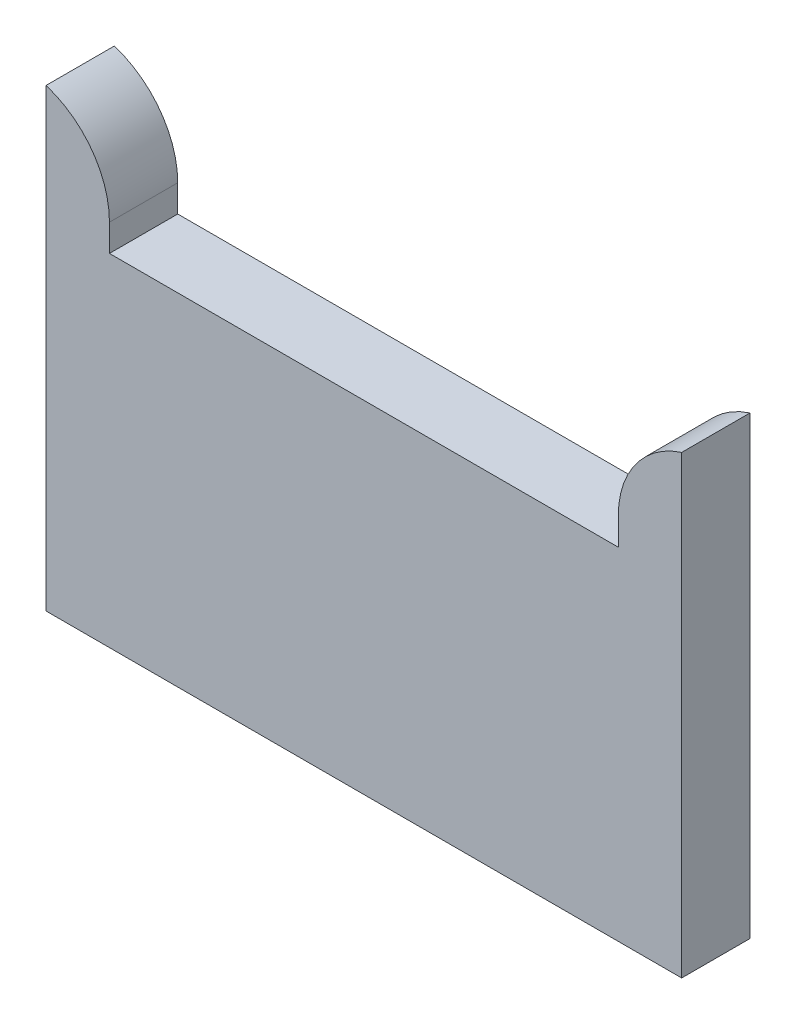
ISO-10303-21;
HEADER;
FILE_DESCRIPTION(('STEP AP214'),'2;1');
FILE_NAME('part.step','',(''),(''),'','','');
FILE_SCHEMA(('AUTOMOTIVE_DESIGN { 1 0 10303 214 1 1 1 1 }'));
ENDSEC;
DATA;
#1=APPLICATION_CONTEXT('core data for automotive mechanical design processes');
#2=APPLICATION_PROTOCOL_DEFINITION('international standard','automotive_design',2000,#1);
#3=PRODUCT_CONTEXT('',#1,'mechanical');
#4=PRODUCT('Part','Part','',(#3));
#5=PRODUCT_RELATED_PRODUCT_CATEGORY('part','',(#4));
#6=PRODUCT_DEFINITION_FORMATION('','',#4);
#7=PRODUCT_DEFINITION_CONTEXT('part definition',#1,'design');
#8=PRODUCT_DEFINITION('design','',#6,#7);
#9=PRODUCT_DEFINITION_SHAPE('','',#8);
#10=(LENGTH_UNIT() NAMED_UNIT(*) SI_UNIT(.MILLI.,.METRE.));
#11=(NAMED_UNIT(*) PLANE_ANGLE_UNIT() SI_UNIT($,.RADIAN.));
#12=(NAMED_UNIT(*) SI_UNIT($,.STERADIAN.) SOLID_ANGLE_UNIT());
#13=UNCERTAINTY_MEASURE_WITH_UNIT(LENGTH_MEASURE(1.E-05),#10,'distance_accuracy_value','');
#14=(GEOMETRIC_REPRESENTATION_CONTEXT(3) GLOBAL_UNCERTAINTY_ASSIGNED_CONTEXT((#13)) GLOBAL_UNIT_ASSIGNED_CONTEXT((#10,
#11,#12)) REPRESENTATION_CONTEXT('',''));
#15=CARTESIAN_POINT('',(0.,0.,0.));
#16=DIRECTION('',(0.,0.,1.));
#17=DIRECTION('',(1.,0.,0.));
#18=AXIS2_PLACEMENT_3D('',#15,#16,#17);
#19=CARTESIAN_POINT('',(-27.9278685437168,-36.6169154228856,6.));
#20=DIRECTION('',(1.,0.,0.));
#21=DIRECTION('',(0.,0.,-1.));
#22=AXIS2_PLACEMENT_3D('',#19,#20,#21);
#23=PLANE('',#22);
#24=DIRECTION('',(0.,-1.,0.));
#25=VECTOR('',#24,1.);
#26=CARTESIAN_POINT('',(-27.9278685437168,-36.6169154228856,0.));
#27=LINE('',#26,#25);
#28=CARTESIAN_POINT('',(-27.9278685437168,3.38308457711443,0.));
#29=VERTEX_POINT('',#28);
#30=CARTESIAN_POINT('',(-27.9278685437168,-36.6169154228856,0.));
#31=VERTEX_POINT('',#30);
#32=EDGE_CURVE('E123',#29,#31,#27,.T.);
#33=ORIENTED_EDGE('',*,*,#32,.T.);
#34=DIRECTION('',(0.,0.,-1.));
#35=VECTOR('',#34,1.);
#36=CARTESIAN_POINT('',(-27.9278685437168,-36.6169154228856,6.));
#37=LINE('',#36,#35);
#38=CARTESIAN_POINT('',(-27.9278685437168,-36.6169154228856,6.));
#39=VERTEX_POINT('',#38);
#40=EDGE_CURVE('E104',#39,#31,#37,.T.);
#41=ORIENTED_EDGE('',*,*,#40,.F.);
#42=DIRECTION('',(0.,-1.,0.));
#43=VECTOR('',#42,1.);
#44=CARTESIAN_POINT('',(-27.9278685437168,-36.6169154228856,6.));
#45=LINE('',#44,#43);
#46=CARTESIAN_POINT('',(-27.9278685437168,3.38308457711443,6.));
#47=VERTEX_POINT('',#46);
#48=EDGE_CURVE('E110',#47,#39,#45,.T.);
#49=ORIENTED_EDGE('',*,*,#48,.F.);
#50=DIRECTION('',(0.,0.,-1.));
#51=VECTOR('',#50,1.);
#52=CARTESIAN_POINT('',(-27.9278685437168,3.38308457711443,6.));
#53=LINE('',#52,#51);
#54=EDGE_CURVE('E155',#47,#29,#53,.T.);
#55=ORIENTED_EDGE('',*,*,#54,.T.);
#56=EDGE_LOOP('',(#33,#41,#49,#55));
#57=FACE_BOUND('',#56,.T.);
#58=ADVANCED_FACE('F37',(#57),#23,.F.);
#59=CARTESIAN_POINT('',(-27.9278685437168,-36.6169154228856,6.));
#60=DIRECTION('',(0.,1.,0.));
#61=DIRECTION('',(0.,0.,1.));
#62=AXIS2_PLACEMENT_3D('',#59,#60,#61);
#63=PLANE('',#62);
#64=DIRECTION('',(1.,0.,0.));
#65=VECTOR('',#64,1.);
#66=CARTESIAN_POINT('',(-27.9278685437168,-36.6169154228856,0.));
#67=LINE('',#66,#65);
#68=CARTESIAN_POINT('',(27.9278685437168,-36.6169154228856,0.));
#69=VERTEX_POINT('',#68);
#70=EDGE_CURVE('E146',#31,#69,#67,.T.);
#71=ORIENTED_EDGE('',*,*,#70,.T.);
#72=DIRECTION('',(0.,0.,-1.));
#73=VECTOR('',#72,1.);
#74=CARTESIAN_POINT('',(27.9278685437168,-36.6169154228856,6.));
#75=LINE('',#74,#73);
#76=CARTESIAN_POINT('',(27.9278685437168,-36.6169154228856,6.));
#77=VERTEX_POINT('',#76);
#78=EDGE_CURVE('E107',#77,#69,#75,.T.);
#79=ORIENTED_EDGE('',*,*,#78,.F.);
#80=DIRECTION('',(1.,0.,0.));
#81=VECTOR('',#80,1.);
#82=CARTESIAN_POINT('',(-27.9278685437168,-36.6169154228856,6.));
#83=LINE('',#82,#81);
#84=EDGE_CURVE('E100',#39,#77,#83,.T.);
#85=ORIENTED_EDGE('',*,*,#84,.F.);
#86=ORIENTED_EDGE('',*,*,#40,.T.);
#87=EDGE_LOOP('',(#71,#79,#85,#86));
#88=FACE_BOUND('',#87,.T.);
#89=ADVANCED_FACE('F102',(#88),#63,.F.);
#90=CARTESIAN_POINT('',(27.9278685437168,-36.6169154228856,6.));
#91=DIRECTION('',(-1.,0.,0.));
#92=DIRECTION('',(0.,0.,1.));
#93=AXIS2_PLACEMENT_3D('',#90,#91,#92);
#94=PLANE('',#93);
#95=DIRECTION('',(0.,1.,0.));
#96=VECTOR('',#95,1.);
#97=CARTESIAN_POINT('',(27.9278685437168,-36.6169154228856,0.));
#98=LINE('',#97,#96);
#99=CARTESIAN_POINT('',(27.9278685437168,3.38308457711443,0.));
#100=VERTEX_POINT('',#99);
#101=EDGE_CURVE('E140',#69,#100,#98,.T.);
#102=ORIENTED_EDGE('',*,*,#101,.T.);
#103=DIRECTION('',(0.,0.,-1.));
#104=VECTOR('',#103,1.);
#105=CARTESIAN_POINT('',(27.9278685437168,3.38308457711443,6.));
#106=LINE('',#105,#104);
#107=CARTESIAN_POINT('',(27.9278685437168,3.38308457711443,6.));
#108=VERTEX_POINT('',#107);
#109=EDGE_CURVE('E128',#108,#100,#106,.T.);
#110=ORIENTED_EDGE('',*,*,#109,.F.);
#111=DIRECTION('',(0.,1.,0.));
#112=VECTOR('',#111,1.);
#113=CARTESIAN_POINT('',(27.9278685437168,-36.6169154228856,6.));
#114=LINE('',#113,#112);
#115=EDGE_CURVE('E109',#77,#108,#114,.T.);
#116=ORIENTED_EDGE('',*,*,#115,.F.);
#117=ORIENTED_EDGE('',*,*,#78,.T.);
#118=EDGE_LOOP('',(#102,#110,#116,#117));
#119=FACE_BOUND('',#118,.T.);
#120=ADVANCED_FACE('F145',(#119),#94,.F.);
#121=CARTESIAN_POINT('',(22.3557292402341,3.38308457711443,6.));
#122=DIRECTION('',(1.,0.,0.));
#123=DIRECTION('',(0.,1.,0.));
#124=AXIS2_PLACEMENT_3D('',#121,#122,#123);
#125=PLANE('',#124);
#126=DIRECTION('',(0.,-1.,0.));
#127=VECTOR('',#126,1.);
#128=CARTESIAN_POINT('',(22.3557292402341,3.38308457711443,6.));
#129=LINE('',#128,#127);
#130=CARTESIAN_POINT('',(22.3557292402342,-4.23961130021835,6.));
#131=VERTEX_POINT('',#130);
#132=CARTESIAN_POINT('',(22.3557292402342,-6.61691542288557,6.));
#133=VERTEX_POINT('',#132);
#134=EDGE_CURVE('E168',#131,#133,#129,.T.);
#135=ORIENTED_EDGE('',*,*,#134,.F.);
#136=DIRECTION('',(0.,0.,-1.));
#137=VECTOR('',#136,1.);
#138=CARTESIAN_POINT('',(22.3557292402342,-4.23961130021835,6.));
#139=LINE('',#138,#137);
#140=CARTESIAN_POINT('',(22.3557292402342,-4.23961130021835,0.));
#141=VERTEX_POINT('',#140);
#142=EDGE_CURVE('E134',#131,#141,#139,.T.);
#143=ORIENTED_EDGE('',*,*,#142,.T.);
#144=DIRECTION('',(0.,-1.,0.));
#145=VECTOR('',#144,1.);
#146=CARTESIAN_POINT('',(22.3557292402341,3.38308457711443,0.));
#147=LINE('',#146,#145);
#148=CARTESIAN_POINT('',(22.3557292402342,-6.61691542288557,0.));
#149=VERTEX_POINT('',#148);
#150=EDGE_CURVE('E142',#141,#149,#147,.T.);
#151=ORIENTED_EDGE('',*,*,#150,.T.);
#152=DIRECTION('',(0.,0.,-1.));
#153=VECTOR('',#152,1.);
#154=CARTESIAN_POINT('',(22.3557292402342,-6.61691542288557,6.));
#155=LINE('',#154,#153);
#156=EDGE_CURVE('E148',#133,#149,#155,.T.);
#157=ORIENTED_EDGE('',*,*,#156,.F.);
#158=EDGE_LOOP('',(#135,#143,#151,#157));
#159=FACE_BOUND('',#158,.T.);
#160=ADVANCED_FACE('F174',(#159),#125,.F.);
#161=CARTESIAN_POINT('',(22.3557292402342,-6.61691542288557,6.));
#162=DIRECTION('',(0.,-1.,0.));
#163=DIRECTION('',(1.,0.,0.));
#164=AXIS2_PLACEMENT_3D('',#161,#162,#163);
#165=PLANE('',#164);
#166=DIRECTION('',(-1.,0.,0.));
#167=VECTOR('',#166,1.);
#168=CARTESIAN_POINT('',(22.3557292402342,-6.61691542288557,0.));
#169=LINE('',#168,#167);
#170=CARTESIAN_POINT('',(-22.3557292402341,-6.61691542288557,0.));
#171=VERTEX_POINT('',#170);
#172=EDGE_CURVE('E160',#149,#171,#169,.T.);
#173=ORIENTED_EDGE('',*,*,#172,.T.);
#174=DIRECTION('',(0.,0.,-1.));
#175=VECTOR('',#174,1.);
#176=CARTESIAN_POINT('',(-22.3557292402341,-6.61691542288557,6.));
#177=LINE('',#176,#175);
#178=CARTESIAN_POINT('',(-22.3557292402341,-6.61691542288557,6.));
#179=VERTEX_POINT('',#178);
#180=EDGE_CURVE('E150',#179,#171,#177,.T.);
#181=ORIENTED_EDGE('',*,*,#180,.F.);
#182=DIRECTION('',(-1.,0.,0.));
#183=VECTOR('',#182,1.);
#184=CARTESIAN_POINT('',(22.3557292402342,-6.61691542288557,6.));
#185=LINE('',#184,#183);
#186=EDGE_CURVE('E166',#133,#179,#185,.T.);
#187=ORIENTED_EDGE('',*,*,#186,.F.);
#188=ORIENTED_EDGE('',*,*,#156,.T.);
#189=EDGE_LOOP('',(#173,#181,#187,#188));
#190=FACE_BOUND('',#189,.T.);
#191=ADVANCED_FACE('F176',(#190),#165,.F.);
#192=CARTESIAN_POINT('',(-22.3557292402341,3.38308457711443,6.));
#193=DIRECTION('',(-1.,0.,0.));
#194=DIRECTION('',(0.,0.,1.));
#195=AXIS2_PLACEMENT_3D('',#192,#193,#194);
#196=PLANE('',#195);
#197=DIRECTION('',(0.,1.,0.));
#198=VECTOR('',#197,1.);
#199=CARTESIAN_POINT('',(-22.3557292402341,3.38308457711443,0.));
#200=LINE('',#199,#198);
#201=CARTESIAN_POINT('',(-22.3557292402341,-4.23961130021835,0.));
#202=VERTEX_POINT('',#201);
#203=EDGE_CURVE('E120',#171,#202,#200,.T.);
#204=ORIENTED_EDGE('',*,*,#203,.T.);
#205=DIRECTION('',(0.,0.,1.));
#206=VECTOR('',#205,1.);
#207=CARTESIAN_POINT('',(-22.3557292402341,-4.23961130021835,6.));
#208=LINE('',#207,#206);
#209=CARTESIAN_POINT('',(-22.3557292402341,-4.23961130021835,6.));
#210=VERTEX_POINT('',#209);
#211=EDGE_CURVE('E126',#202,#210,#208,.T.);
#212=ORIENTED_EDGE('',*,*,#211,.T.);
#213=DIRECTION('',(0.,1.,0.));
#214=VECTOR('',#213,1.);
#215=CARTESIAN_POINT('',(-22.3557292402341,3.38308457711443,6.));
#216=LINE('',#215,#214);
#217=EDGE_CURVE('E157',#179,#210,#216,.T.);
#218=ORIENTED_EDGE('',*,*,#217,.F.);
#219=ORIENTED_EDGE('',*,*,#180,.T.);
#220=EDGE_LOOP('',(#204,#212,#218,#219));
#221=FACE_BOUND('',#220,.T.);
#222=ADVANCED_FACE('F180',(#221),#196,.F.);
#223=CARTESIAN_POINT('',(0.,0.,6.));
#224=DIRECTION('',(0.,0.,-1.));
#225=DIRECTION('',(-1.,0.,0.));
#226=AXIS2_PLACEMENT_3D('',#223,#224,#225);
#227=PLANE('',#226);
#228=ORIENTED_EDGE('',*,*,#115,.T.);
#229=CARTESIAN_POINT('',(30.3557292402342,-4.23961130021834,6.));
#230=DIRECTION('',(0.,0.,-1.));
#231=DIRECTION('',(-1.,0.,0.));
#232=AXIS2_PLACEMENT_3D('',#229,#230,#231);
#233=CIRCLE('',#232,8.);
#234=EDGE_CURVE('E11',#108,#131,#233,.F.);
#235=ORIENTED_EDGE('',*,*,#234,.T.);
#236=ORIENTED_EDGE('',*,*,#134,.T.);
#237=ORIENTED_EDGE('',*,*,#186,.T.);
#238=ORIENTED_EDGE('',*,*,#217,.T.);
#239=CARTESIAN_POINT('',(-30.3557292402341,-4.23961130021835,6.));
#240=DIRECTION('',(0.,0.,-1.));
#241=DIRECTION('',(-1.,0.,0.));
#242=AXIS2_PLACEMENT_3D('',#239,#240,#241);
#243=CIRCLE('',#242,8.);
#244=EDGE_CURVE('E116',#210,#47,#243,.F.);
#245=ORIENTED_EDGE('',*,*,#244,.T.);
#246=ORIENTED_EDGE('',*,*,#48,.T.);
#247=ORIENTED_EDGE('',*,*,#84,.T.);
#248=EDGE_LOOP('',(#228,#235,#236,#237,#238,#245,#246,#247));
#249=FACE_BOUND('',#248,.T.);
#250=ADVANCED_FACE('F113',(#249),#227,.F.);
#251=CARTESIAN_POINT('',(0.,0.,0.));
#252=DIRECTION('',(0.,0.,-1.));
#253=DIRECTION('',(-1.,0.,0.));
#254=AXIS2_PLACEMENT_3D('',#251,#252,#253);
#255=PLANE('',#254);
#256=ORIENTED_EDGE('',*,*,#150,.F.);
#257=CARTESIAN_POINT('',(30.3557292402342,-4.23961130021834,0.));
#258=DIRECTION('',(0.,0.,-1.));
#259=DIRECTION('',(-1.,0.,0.));
#260=AXIS2_PLACEMENT_3D('',#257,#258,#259);
#261=CIRCLE('',#260,8.);
#262=EDGE_CURVE('E45',#141,#100,#261,.T.);
#263=ORIENTED_EDGE('',*,*,#262,.T.);
#264=ORIENTED_EDGE('',*,*,#101,.F.);
#265=ORIENTED_EDGE('',*,*,#70,.F.);
#266=ORIENTED_EDGE('',*,*,#32,.F.);
#267=CARTESIAN_POINT('',(-30.3557292402341,-4.23961130021835,0.));
#268=DIRECTION('',(0.,0.,-1.));
#269=DIRECTION('',(-1.,0.,0.));
#270=AXIS2_PLACEMENT_3D('',#267,#268,#269);
#271=CIRCLE('',#270,8.);
#272=EDGE_CURVE('E124',#29,#202,#271,.T.);
#273=ORIENTED_EDGE('',*,*,#272,.T.);
#274=ORIENTED_EDGE('',*,*,#203,.F.);
#275=ORIENTED_EDGE('',*,*,#172,.F.);
#276=EDGE_LOOP('',(#256,#263,#264,#265,#266,#273,#274,#275));
#277=FACE_BOUND('',#276,.T.);
#278=ADVANCED_FACE('F139',(#277),#255,.T.);
#279=CARTESIAN_POINT('',(-30.3557292402341,-4.23961130021835,6.));
#280=DIRECTION('',(0.,0.,1.));
#281=DIRECTION('',(1.,0.,0.));
#282=AXIS2_PLACEMENT_3D('',#279,#280,#281);
#283=CYLINDRICAL_SURFACE('',#282,8.);
#284=ORIENTED_EDGE('',*,*,#244,.F.);
#285=ORIENTED_EDGE('',*,*,#211,.F.);
#286=ORIENTED_EDGE('',*,*,#272,.F.);
#287=ORIENTED_EDGE('',*,*,#54,.F.);
#288=EDGE_LOOP('',(#284,#285,#286,#287));
#289=FACE_BOUND('',#288,.T.);
#290=ADVANCED_FACE('F183',(#289),#283,.T.);
#291=CARTESIAN_POINT('',(30.3557292402342,-4.23961130021834,6.));
#292=DIRECTION('',(0.,0.,-1.));
#293=DIRECTION('',(-1.,0.,0.));
#294=AXIS2_PLACEMENT_3D('',#291,#292,#293);
#295=CYLINDRICAL_SURFACE('',#294,8.);
#296=ORIENTED_EDGE('',*,*,#234,.F.);
#297=ORIENTED_EDGE('',*,*,#109,.T.);
#298=ORIENTED_EDGE('',*,*,#262,.F.);
#299=ORIENTED_EDGE('',*,*,#142,.F.);
#300=EDGE_LOOP('',(#296,#297,#298,#299));
#301=FACE_BOUND('',#300,.T.);
#302=ADVANCED_FACE('F39',(#301),#295,.T.);
#303=CLOSED_SHELL('',(#58,#89,#120,#160,#191,#222,#250,#278,#290,#302));
#304=MANIFOLD_SOLID_BREP('B2',#303);
#305=ADVANCED_BREP_SHAPE_REPRESENTATION('',(#18,#304),#14);
#306=SHAPE_DEFINITION_REPRESENTATION(#9,#305);
ENDSEC;
END-ISO-10303-21;
